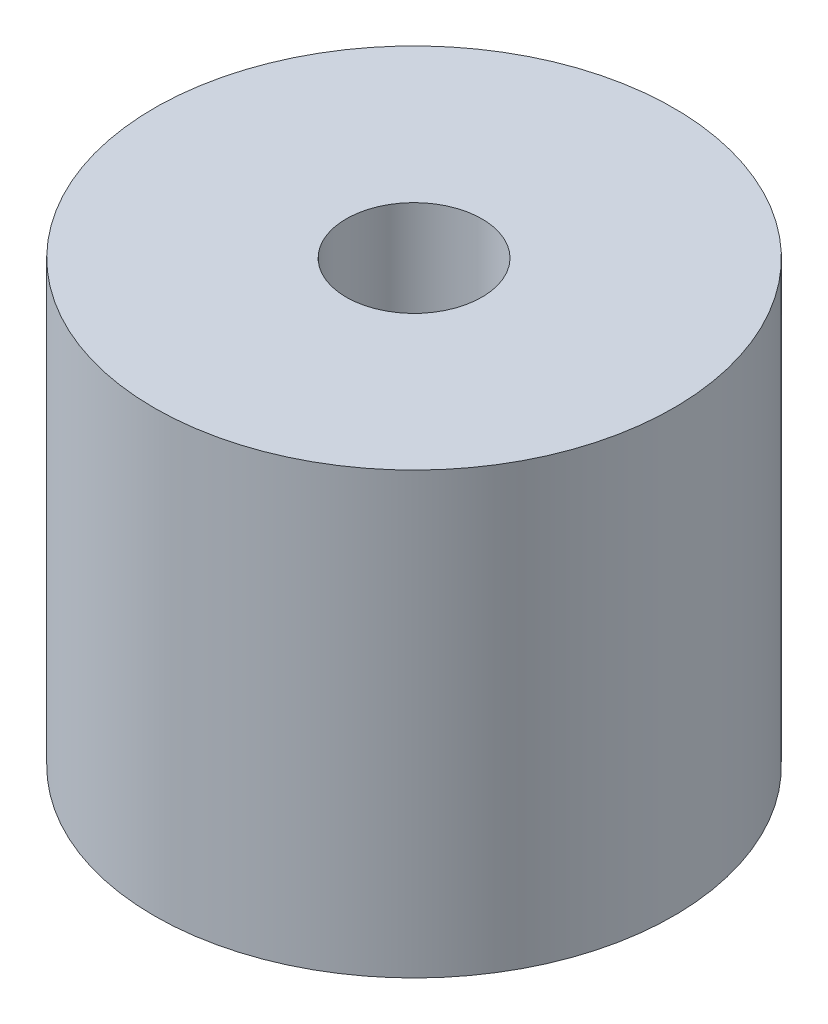
ISO-10303-21;
HEADER;
FILE_DESCRIPTION(('STEP AP214'),'2;1');
FILE_NAME('part.step','',(''),(''),'','','');
FILE_SCHEMA(('AUTOMOTIVE_DESIGN { 1 0 10303 214 1 1 1 1 }'));
ENDSEC;
DATA;
#1=APPLICATION_CONTEXT('core data for automotive mechanical design processes');
#2=APPLICATION_PROTOCOL_DEFINITION('international standard','automotive_design',2000,#1);
#3=PRODUCT_CONTEXT('',#1,'mechanical');
#4=PRODUCT('Part','Part','',(#3));
#5=PRODUCT_RELATED_PRODUCT_CATEGORY('part','',(#4));
#6=PRODUCT_DEFINITION_FORMATION('','',#4);
#7=PRODUCT_DEFINITION_CONTEXT('part definition',#1,'design');
#8=PRODUCT_DEFINITION('design','',#6,#7);
#9=PRODUCT_DEFINITION_SHAPE('','',#8);
#10=(LENGTH_UNIT() NAMED_UNIT(*) SI_UNIT(.MILLI.,.METRE.));
#11=(NAMED_UNIT(*) PLANE_ANGLE_UNIT() SI_UNIT($,.RADIAN.));
#12=(NAMED_UNIT(*) SI_UNIT($,.STERADIAN.) SOLID_ANGLE_UNIT());
#13=UNCERTAINTY_MEASURE_WITH_UNIT(LENGTH_MEASURE(1.E-05),#10,'distance_accuracy_value','');
#14=(GEOMETRIC_REPRESENTATION_CONTEXT(3) GLOBAL_UNCERTAINTY_ASSIGNED_CONTEXT((#13)) GLOBAL_UNIT_ASSIGNED_CONTEXT((#10,
#11,#12)) REPRESENTATION_CONTEXT('',''));
#15=CARTESIAN_POINT('',(0.,0.,0.));
#16=DIRECTION('',(0.,0.,1.));
#17=DIRECTION('',(1.,0.,0.));
#18=AXIS2_PLACEMENT_3D('',#15,#16,#17);
#19=CARTESIAN_POINT('',(0.,16.129,0.));
#20=DIRECTION('',(0.,-1.,0.));
#21=DIRECTION('',(0.,0.,-1.));
#22=AXIS2_PLACEMENT_3D('',#19,#20,#21);
#23=CYLINDRICAL_SURFACE('',#22,9.525);
#24=CARTESIAN_POINT('',(0.,16.129,0.));
#25=DIRECTION('',(0.,1.,0.));
#26=DIRECTION('',(0.,0.,1.));
#27=AXIS2_PLACEMENT_3D('',#24,#25,#26);
#28=CIRCLE('',#27,9.525);
#29=CARTESIAN_POINT('',(0.,16.129,9.525));
#30=VERTEX_POINT('',#29);
#31=EDGE_CURVE('E10',#30,#30,#28,.T.);
#32=ORIENTED_EDGE('',*,*,#31,.F.);
#33=EDGE_LOOP('',(#32));
#34=FACE_BOUND('',#33,.T.);
#35=CARTESIAN_POINT('',(0.,0.,0.));
#36=DIRECTION('',(0.,1.,0.));
#37=DIRECTION('',(0.,0.,1.));
#38=AXIS2_PLACEMENT_3D('',#35,#36,#37);
#39=CIRCLE('',#38,9.525);
#40=CARTESIAN_POINT('',(0.,0.,9.525));
#41=VERTEX_POINT('',#40);
#42=EDGE_CURVE('E34',#41,#41,#39,.T.);
#43=ORIENTED_EDGE('',*,*,#42,.T.);
#44=EDGE_LOOP('',(#43));
#45=FACE_BOUND('',#44,.T.);
#46=ADVANCED_FACE('F31',(#34,#45),#23,.T.);
#47=CARTESIAN_POINT('',(0.,16.129,0.));
#48=DIRECTION('',(0.,1.,0.));
#49=DIRECTION('',(0.,0.,1.));
#50=AXIS2_PLACEMENT_3D('',#47,#48,#49);
#51=PLANE('',#50);
#52=CARTESIAN_POINT('',(0.,16.129,0.));
#53=DIRECTION('',(0.,1.,0.));
#54=DIRECTION('',(0.,0.,1.));
#55=AXIS2_PLACEMENT_3D('',#52,#53,#54);
#56=CIRCLE('',#55,2.48919999999999);
#57=CARTESIAN_POINT('',(0.,16.129,2.48919999999999));
#58=VERTEX_POINT('',#57);
#59=EDGE_CURVE('E45',#58,#58,#56,.T.);
#60=ORIENTED_EDGE('',*,*,#59,.F.);
#61=EDGE_LOOP('',(#60));
#62=FACE_BOUND('',#61,.T.);
#63=ORIENTED_EDGE('',*,*,#31,.T.);
#64=EDGE_LOOP('',(#63));
#65=FACE_BOUND('',#64,.T.);
#66=ADVANCED_FACE('F51',(#62,#65),#51,.T.);
#67=CARTESIAN_POINT('',(0.,0.,0.));
#68=DIRECTION('',(0.,1.,0.));
#69=DIRECTION('',(0.,0.,1.));
#70=AXIS2_PLACEMENT_3D('',#67,#68,#69);
#71=PLANE('',#70);
#72=CARTESIAN_POINT('',(0.,0.,0.));
#73=DIRECTION('',(0.,1.,0.));
#74=DIRECTION('',(0.,0.,1.));
#75=AXIS2_PLACEMENT_3D('',#72,#73,#74);
#76=CIRCLE('',#75,2.4892);
#77=CARTESIAN_POINT('',(0.,0.,2.4892));
#78=VERTEX_POINT('',#77);
#79=EDGE_CURVE('E41',#78,#78,#76,.T.);
#80=ORIENTED_EDGE('',*,*,#79,.T.);
#81=EDGE_LOOP('',(#80));
#82=FACE_BOUND('',#81,.T.);
#83=ORIENTED_EDGE('',*,*,#42,.F.);
#84=EDGE_LOOP('',(#83));
#85=FACE_BOUND('',#84,.T.);
#86=ADVANCED_FACE('F53',(#82,#85),#71,.F.);
#87=CARTESIAN_POINT('',(0.,16.129,0.));
#88=DIRECTION('',(0.,1.,0.));
#89=DIRECTION('',(0.,0.,1.));
#90=AXIS2_PLACEMENT_3D('',#87,#88,#89);
#91=CYLINDRICAL_SURFACE('',#90,2.48919999999999);
#92=ORIENTED_EDGE('',*,*,#79,.F.);
#93=EDGE_LOOP('',(#92));
#94=FACE_BOUND('',#93,.T.);
#95=ORIENTED_EDGE('',*,*,#59,.T.);
#96=EDGE_LOOP('',(#95));
#97=FACE_BOUND('',#96,.T.);
#98=ADVANCED_FACE('F49',(#94,#97),#91,.F.);
#99=CLOSED_SHELL('',(#46,#66,#86,#98));
#100=MANIFOLD_SOLID_BREP('B2',#99);
#101=ADVANCED_BREP_SHAPE_REPRESENTATION('',(#18,#100),#14);
#102=SHAPE_DEFINITION_REPRESENTATION(#9,#101);
ENDSEC;
END-ISO-10303-21;
